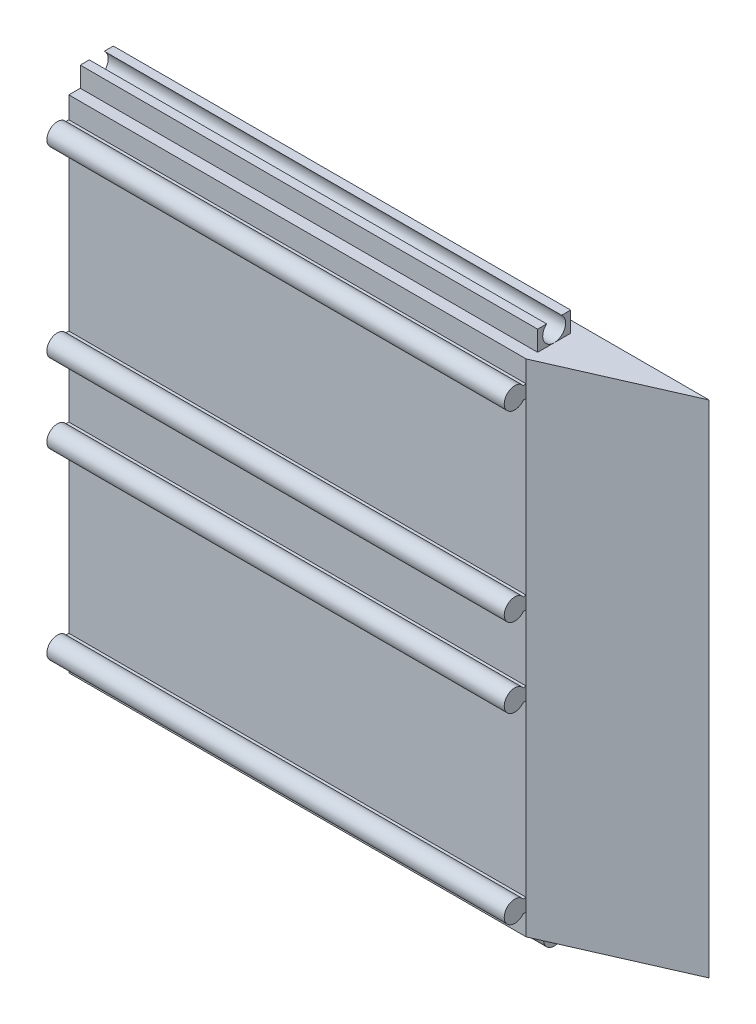
ISO-10303-21;
HEADER;
FILE_DESCRIPTION(('STEP AP214'),'2;1');
FILE_NAME('part.step','',(''),(''),'','','');
FILE_SCHEMA(('AUTOMOTIVE_DESIGN { 1 0 10303 214 1 1 1 1 }'));
ENDSEC;
DATA;
#1=APPLICATION_CONTEXT('core data for automotive mechanical design processes');
#2=APPLICATION_PROTOCOL_DEFINITION('international standard','automotive_design',2000,#1);
#3=PRODUCT_CONTEXT('',#1,'mechanical');
#4=PRODUCT('Part','Part','',(#3));
#5=PRODUCT_RELATED_PRODUCT_CATEGORY('part','',(#4));
#6=PRODUCT_DEFINITION_FORMATION('','',#4);
#7=PRODUCT_DEFINITION_CONTEXT('part definition',#1,'design');
#8=PRODUCT_DEFINITION('design','',#6,#7);
#9=PRODUCT_DEFINITION_SHAPE('','',#8);
#10=(LENGTH_UNIT() NAMED_UNIT(*) SI_UNIT(.MILLI.,.METRE.));
#11=(NAMED_UNIT(*) PLANE_ANGLE_UNIT() SI_UNIT($,.RADIAN.));
#12=(NAMED_UNIT(*) SI_UNIT($,.STERADIAN.) SOLID_ANGLE_UNIT());
#13=UNCERTAINTY_MEASURE_WITH_UNIT(LENGTH_MEASURE(1.E-05),#10,'distance_accuracy_value','');
#14=(GEOMETRIC_REPRESENTATION_CONTEXT(3) GLOBAL_UNCERTAINTY_ASSIGNED_CONTEXT((#13)) GLOBAL_UNIT_ASSIGNED_CONTEXT((#10,
#11,#12)) REPRESENTATION_CONTEXT('',''));
#15=CARTESIAN_POINT('',(0.,0.,0.));
#16=DIRECTION('',(0.,0.,1.));
#17=DIRECTION('',(1.,0.,0.));
#18=AXIS2_PLACEMENT_3D('',#15,#16,#17);
#19=CARTESIAN_POINT('',(0.,45.7500000000069,11.));
#20=DIRECTION('',(0.,0.,1.));
#21=DIRECTION('',(0.,-1.,0.));
#22=AXIS2_PLACEMENT_3D('',#19,#20,#21);
#23=PLANE('',#22);
#24=DIRECTION('',(0.,-1.,0.));
#25=VECTOR('',#24,1.);
#26=CARTESIAN_POINT('',(90.,164.500000000007,11.));
#27=LINE('',#26,#25);
#28=CARTESIAN_POINT('',(90.,140.,11.));
#29=VERTEX_POINT('',#28);
#30=CARTESIAN_POINT('',(90.,135.750000000001,11.));
#31=VERTEX_POINT('',#30);
#32=EDGE_CURVE('E246',#29,#31,#27,.T.);
#33=ORIENTED_EDGE('',*,*,#32,.F.);
#34=DIRECTION('',(-1.,0.,0.));
#35=VECTOR('',#34,1.);
#36=CARTESIAN_POINT('',(90.,140.,11.));
#37=LINE('',#36,#35);
#38=CARTESIAN_POINT('',(0.,140.,11.));
#39=VERTEX_POINT('',#38);
#40=EDGE_CURVE('E456',#29,#39,#37,.T.);
#41=ORIENTED_EDGE('',*,*,#40,.T.);
#42=DIRECTION('',(0.,-1.,0.));
#43=VECTOR('',#42,1.);
#44=CARTESIAN_POINT('',(0.,143.950000000007,11.));
#45=LINE('',#44,#43);
#46=CARTESIAN_POINT('',(0.,135.750000000001,11.));
#47=VERTEX_POINT('',#46);
#48=EDGE_CURVE('E319',#39,#47,#45,.T.);
#49=ORIENTED_EDGE('',*,*,#48,.T.);
#50=DIRECTION('',(1.,0.,0.));
#51=VECTOR('',#50,1.);
#52=CARTESIAN_POINT('',(90.,135.750000000001,11.));
#53=LINE('',#52,#51);
#54=EDGE_CURVE('E436',#47,#31,#53,.T.);
#55=ORIENTED_EDGE('',*,*,#54,.T.);
#56=EDGE_LOOP('',(#33,#41,#49,#55));
#57=FACE_BOUND('',#56,.T.);
#58=ADVANCED_FACE('F33',(#57),#23,.T.);
#59=CARTESIAN_POINT('',(90.,133.25,11.));
#60=VERTEX_POINT('',#59);
#61=CARTESIAN_POINT('',(90.,99.7500000000067,11.));
#62=VERTEX_POINT('',#61);
#63=EDGE_CURVE('E499',#60,#62,#27,.T.);
#64=ORIENTED_EDGE('',*,*,#63,.F.);
#65=DIRECTION('',(1.,0.,0.));
#66=VECTOR('',#65,1.);
#67=CARTESIAN_POINT('',(0.,133.25,11.));
#68=LINE('',#67,#66);
#69=CARTESIAN_POINT('',(0.,133.25,11.));
#70=VERTEX_POINT('',#69);
#71=EDGE_CURVE('E296',#70,#60,#68,.T.);
#72=ORIENTED_EDGE('',*,*,#71,.F.);
#73=DIRECTION('',(0.,-1.,0.));
#74=VECTOR('',#73,1.);
#75=CARTESIAN_POINT('',(0.,133.25,11.));
#76=LINE('',#75,#74);
#77=CARTESIAN_POINT('',(0.,99.7500000000067,11.));
#78=VERTEX_POINT('',#77);
#79=EDGE_CURVE('E425',#70,#78,#76,.T.);
#80=ORIENTED_EDGE('',*,*,#79,.T.);
#81=DIRECTION('',(1.,0.,0.));
#82=VECTOR('',#81,1.);
#83=CARTESIAN_POINT('',(0.,99.7500000000067,11.));
#84=LINE('',#83,#82);
#85=EDGE_CURVE('E293',#78,#62,#84,.T.);
#86=ORIENTED_EDGE('',*,*,#85,.T.);
#87=EDGE_LOOP('',(#64,#72,#80,#86));
#88=FACE_BOUND('',#87,.T.);
#89=ADVANCED_FACE('F555',(#88),#23,.T.);
#90=CARTESIAN_POINT('',(90.,97.2500000000069,11.));
#91=VERTEX_POINT('',#90);
#92=CARTESIAN_POINT('',(90.,84.25,11.));
#93=VERTEX_POINT('',#92);
#94=EDGE_CURVE('E502',#91,#93,#27,.T.);
#95=ORIENTED_EDGE('',*,*,#94,.F.);
#96=DIRECTION('',(1.,0.,0.));
#97=VECTOR('',#96,1.);
#98=CARTESIAN_POINT('',(0.,97.2500000000069,11.));
#99=LINE('',#98,#97);
#100=CARTESIAN_POINT('',(0.,97.2500000000069,11.));
#101=VERTEX_POINT('',#100);
#102=EDGE_CURVE('E286',#101,#91,#99,.T.);
#103=ORIENTED_EDGE('',*,*,#102,.F.);
#104=DIRECTION('',(0.,-1.,0.));
#105=VECTOR('',#104,1.);
#106=CARTESIAN_POINT('',(0.,97.2500000000069,11.));
#107=LINE('',#106,#105);
#108=CARTESIAN_POINT('',(0.,84.25,11.));
#109=VERTEX_POINT('',#108);
#110=EDGE_CURVE('E413',#101,#109,#107,.T.);
#111=ORIENTED_EDGE('',*,*,#110,.T.);
#112=DIRECTION('',(1.,0.,0.));
#113=VECTOR('',#112,1.);
#114=CARTESIAN_POINT('',(0.,84.25,11.));
#115=LINE('',#114,#113);
#116=EDGE_CURVE('E283',#109,#93,#115,.T.);
#117=ORIENTED_EDGE('',*,*,#116,.T.);
#118=EDGE_LOOP('',(#95,#103,#111,#117));
#119=FACE_BOUND('',#118,.T.);
#120=ADVANCED_FACE('F540',(#119),#23,.T.);
#121=CARTESIAN_POINT('',(90.,81.7500000000004,11.));
#122=VERTEX_POINT('',#121);
#123=CARTESIAN_POINT('',(90.,48.2500000000067,11.));
#124=VERTEX_POINT('',#123);
#125=EDGE_CURVE('E244',#122,#124,#27,.T.);
#126=ORIENTED_EDGE('',*,*,#125,.F.);
#127=DIRECTION('',(1.,0.,0.));
#128=VECTOR('',#127,1.);
#129=CARTESIAN_POINT('',(0.,81.7500000000004,11.));
#130=LINE('',#129,#128);
#131=CARTESIAN_POINT('',(0.,81.7500000000004,11.));
#132=VERTEX_POINT('',#131);
#133=EDGE_CURVE('E276',#132,#122,#130,.T.);
#134=ORIENTED_EDGE('',*,*,#133,.F.);
#135=DIRECTION('',(0.,-1.,0.));
#136=VECTOR('',#135,1.);
#137=CARTESIAN_POINT('',(0.,81.7500000000004,11.));
#138=LINE('',#137,#136);
#139=CARTESIAN_POINT('',(0.,48.2500000000067,11.));
#140=VERTEX_POINT('',#139);
#141=EDGE_CURVE('E401',#132,#140,#138,.T.);
#142=ORIENTED_EDGE('',*,*,#141,.T.);
#143=DIRECTION('',(1.,0.,0.));
#144=VECTOR('',#143,1.);
#145=CARTESIAN_POINT('',(0.,48.2500000000067,11.));
#146=LINE('',#145,#144);
#147=EDGE_CURVE('E273',#140,#124,#146,.T.);
#148=ORIENTED_EDGE('',*,*,#147,.T.);
#149=EDGE_LOOP('',(#126,#134,#142,#148));
#150=FACE_BOUND('',#149,.T.);
#151=ADVANCED_FACE('F514',(#150),#23,.T.);
#152=CARTESIAN_POINT('',(90.,39.2500000000069,-5.49999999999999));
#153=DIRECTION('',(1.,0.,0.));
#154=DIRECTION('',(0.,0.,-1.));
#155=AXIS2_PLACEMENT_3D('',#152,#153,#154);
#156=PLANE('',#155);
#157=DIRECTION('',(0.,-1.,0.));
#158=VECTOR('',#157,1.);
#159=CARTESIAN_POINT('',(90.,41.5000000000069,11.));
#160=LINE('',#159,#158);
#161=EDGE_CURVE('E11',#31,#60,#160,.T.);
#162=ORIENTED_EDGE('',*,*,#161,.F.);
#163=DIRECTION('',(0.,0.,1.));
#164=VECTOR('',#163,1.);
#165=CARTESIAN_POINT('',(90.,135.750000000001,-6.74999999999999));
#166=LINE('',#165,#164);
#167=CARTESIAN_POINT('',(90.,135.750000000001,11.5937617924897));
#168=VERTEX_POINT('',#167);
#169=EDGE_CURVE('E316',#31,#168,#166,.T.);
#170=ORIENTED_EDGE('',*,*,#169,.T.);
#171=CARTESIAN_POINT('',(90.,134.500000000007,13.25));
#172=DIRECTION('',(1.,0.,0.));
#173=DIRECTION('',(0.,0.,-1.));
#174=AXIS2_PLACEMENT_3D('',#171,#172,#173);
#175=CIRCLE('',#174,2.075);
#176=CARTESIAN_POINT('',(90.,133.25,11.5937617925001));
#177=VERTEX_POINT('',#176);
#178=EDGE_CURVE('E318',#168,#177,#175,.T.);
#179=ORIENTED_EDGE('',*,*,#178,.T.);
#180=DIRECTION('',(0.,0.,-1.));
#181=VECTOR('',#180,1.);
#182=CARTESIAN_POINT('',(90.,133.25,11.5937617925001));
#183=LINE('',#182,#181);
#184=EDGE_CURVE('E322',#177,#60,#183,.T.);
#185=ORIENTED_EDGE('',*,*,#184,.T.);
#186=EDGE_LOOP('',(#162,#170,#179,#185));
#187=FACE_BOUND('',#186,.T.);
#188=ADVANCED_FACE('F561',(#187),#156,.T.);
#189=EDGE_CURVE('E42',#62,#91,#160,.T.);
#190=ORIENTED_EDGE('',*,*,#189,.F.);
#191=DIRECTION('',(0.,0.,1.));
#192=VECTOR('',#191,1.);
#193=CARTESIAN_POINT('',(90.,99.7500000000067,11.));
#194=LINE('',#193,#192);
#195=CARTESIAN_POINT('',(90.,99.7500000000067,11.5937617924998));
#196=VERTEX_POINT('',#195);
#197=EDGE_CURVE('E325',#62,#196,#194,.T.);
#198=ORIENTED_EDGE('',*,*,#197,.T.);
#199=CARTESIAN_POINT('',(90.,98.5000000000005,13.2499999999997));
#200=DIRECTION('',(1.,0.,0.));
#201=DIRECTION('',(0.,0.,-1.));
#202=AXIS2_PLACEMENT_3D('',#199,#200,#201);
#203=CIRCLE('',#202,2.07499999999946);
#204=CARTESIAN_POINT('',(90.,97.2500000000069,11.5937617924904));
#205=VERTEX_POINT('',#204);
#206=EDGE_CURVE('E328',#196,#205,#203,.T.);
#207=ORIENTED_EDGE('',*,*,#206,.T.);
#208=DIRECTION('',(0.,0.,-1.));
#209=VECTOR('',#208,1.);
#210=CARTESIAN_POINT('',(90.,97.2500000000069,11.5937617924904));
#211=LINE('',#210,#209);
#212=EDGE_CURVE('E331',#205,#91,#211,.T.);
#213=ORIENTED_EDGE('',*,*,#212,.T.);
#214=EDGE_LOOP('',(#190,#198,#207,#213));
#215=FACE_BOUND('',#214,.T.);
#216=ADVANCED_FACE('F624',(#215),#156,.T.);
#217=EDGE_CURVE('E508',#93,#122,#160,.T.);
#218=ORIENTED_EDGE('',*,*,#217,.F.);
#219=DIRECTION('',(0.,7.4792486729047E-13,1.));
#220=VECTOR('',#219,1.);
#221=CARTESIAN_POINT('',(90.,84.25,11.));
#222=LINE('',#221,#220);
#223=CARTESIAN_POINT('',(90.,84.2500000000005,11.5937617924898));
#224=VERTEX_POINT('',#223);
#225=EDGE_CURVE('E334',#93,#224,#222,.T.);
#226=ORIENTED_EDGE('',*,*,#225,.T.);
#227=CARTESIAN_POINT('',(90.,83.0000000000071,13.25));
#228=DIRECTION('',(1.,0.,0.));
#229=DIRECTION('',(0.,0.,-1.));
#230=AXIS2_PLACEMENT_3D('',#227,#228,#229);
#231=CIRCLE('',#230,2.075);
#232=CARTESIAN_POINT('',(90.,81.7500000000004,11.5937617924999));
#233=VERTEX_POINT('',#232);
#234=EDGE_CURVE('E337',#224,#233,#231,.T.);
#235=ORIENTED_EDGE('',*,*,#234,.T.);
#236=DIRECTION('',(0.,0.,-1.));
#237=VECTOR('',#236,1.);
#238=CARTESIAN_POINT('',(90.,81.7500000000004,11.5937617924999));
#239=LINE('',#238,#237);
#240=EDGE_CURVE('E340',#233,#122,#239,.T.);
#241=ORIENTED_EDGE('',*,*,#240,.T.);
#242=EDGE_LOOP('',(#218,#226,#235,#241));
#243=FACE_BOUND('',#242,.T.);
#244=ADVANCED_FACE('F907',(#243),#156,.T.);
#245=CARTESIAN_POINT('',(90.,45.7500000000069,11.));
#246=VERTEX_POINT('',#245);
#247=EDGE_CURVE('E44',#124,#246,#160,.T.);
#248=ORIENTED_EDGE('',*,*,#247,.F.);
#249=DIRECTION('',(0.,0.,1.));
#250=VECTOR('',#249,1.);
#251=CARTESIAN_POINT('',(90.,48.2500000000067,11.));
#252=LINE('',#251,#250);
#253=CARTESIAN_POINT('',(90.,48.2500000000067,11.5937617924998));
#254=VERTEX_POINT('',#253);
#255=EDGE_CURVE('E343',#124,#254,#252,.T.);
#256=ORIENTED_EDGE('',*,*,#255,.T.);
#257=CARTESIAN_POINT('',(90.,47.0000000000005,13.2499999999997));
#258=DIRECTION('',(1.,0.,0.));
#259=DIRECTION('',(0.,0.,-1.));
#260=AXIS2_PLACEMENT_3D('',#257,#258,#259);
#261=CIRCLE('',#260,2.07499999999947);
#262=CARTESIAN_POINT('',(90.,45.7500000000069,11.5937617924904));
#263=VERTEX_POINT('',#262);
#264=EDGE_CURVE('E346',#254,#263,#261,.T.);
#265=ORIENTED_EDGE('',*,*,#264,.T.);
#266=DIRECTION('',(0.,0.,-1.));
#267=VECTOR('',#266,1.);
#268=CARTESIAN_POINT('',(90.,45.7500000000069,11.5937617924904));
#269=LINE('',#268,#267);
#270=EDGE_CURVE('E349',#263,#246,#269,.T.);
#271=ORIENTED_EDGE('',*,*,#270,.T.);
#272=EDGE_LOOP('',(#248,#256,#265,#271));
#273=FACE_BOUND('',#272,.T.);
#274=ADVANCED_FACE('F511',(#273),#156,.T.);
#275=DIRECTION('',(0.,0.,1.));
#276=VECTOR('',#275,1.);
#277=CARTESIAN_POINT('',(90.,140.,11.));
#278=LINE('',#277,#276);
#279=CARTESIAN_POINT('',(90.,140.,2.25));
#280=VERTEX_POINT('',#279);
#281=CARTESIAN_POINT('',(90.,140.,5.5));
#282=VERTEX_POINT('',#281);
#283=EDGE_CURVE('E490',#280,#282,#278,.T.);
#284=ORIENTED_EDGE('',*,*,#283,.F.);
#285=DIRECTION('',(0.,1.,0.));
#286=VECTOR('',#285,1.);
#287=CARTESIAN_POINT('',(90.,140.,2.25));
#288=LINE('',#287,#286);
#289=CARTESIAN_POINT('',(90.,143.95,2.25));
#290=VERTEX_POINT('',#289);
#291=EDGE_CURVE('E449',#280,#290,#288,.T.);
#292=ORIENTED_EDGE('',*,*,#291,.T.);
#293=DIRECTION('',(0.,0.,-1.));
#294=VECTOR('',#293,1.);
#295=CARTESIAN_POINT('',(90.,143.950000000007,-6.74999999999999));
#296=LINE('',#295,#294);
#297=CARTESIAN_POINT('',(90.,143.950000000007,4.02605970271009));
#298=VERTEX_POINT('',#297);
#299=EDGE_CURVE('E443',#298,#290,#296,.T.);
#300=ORIENTED_EDGE('',*,*,#299,.F.);
#301=CARTESIAN_POINT('',(90.,142.25,5.5));
#302=DIRECTION('',(-1.,0.,0.));
#303=DIRECTION('',(0.,0.,1.));
#304=AXIS2_PLACEMENT_3D('',#301,#302,#303);
#305=CIRCLE('',#304,2.25);
#306=EDGE_CURVE('E477',#298,#282,#305,.T.);
#307=ORIENTED_EDGE('',*,*,#306,.T.);
#308=EDGE_LOOP('',(#284,#292,#300,#307));
#309=FACE_BOUND('',#308,.T.);
#310=ADVANCED_FACE('F591',(#309),#156,.T.);
#311=CARTESIAN_POINT('',(90.,140.,8.75));
#312=VERTEX_POINT('',#311);
#313=EDGE_CURVE('E51',#282,#312,#278,.T.);
#314=ORIENTED_EDGE('',*,*,#313,.F.);
#315=CARTESIAN_POINT('',(90.,143.950000000007,6.97394029728991));
#316=VERTEX_POINT('',#315);
#317=EDGE_CURVE('E480',#282,#316,#305,.T.);
#318=ORIENTED_EDGE('',*,*,#317,.T.);
#319=CARTESIAN_POINT('',(90.,143.95,8.74999999999999));
#320=VERTEX_POINT('',#319);
#321=EDGE_CURVE('E435',#320,#316,#296,.T.);
#322=ORIENTED_EDGE('',*,*,#321,.F.);
#323=DIRECTION('',(0.,-1.,0.));
#324=VECTOR('',#323,1.);
#325=CARTESIAN_POINT('',(90.,143.95,8.74999999999999));
#326=LINE('',#325,#324);
#327=EDGE_CURVE('E463',#320,#312,#326,.T.);
#328=ORIENTED_EDGE('',*,*,#327,.T.);
#329=EDGE_LOOP('',(#314,#318,#322,#328));
#330=FACE_BOUND('',#329,.T.);
#331=ADVANCED_FACE('F577',(#330),#156,.T.);
#332=CARTESIAN_POINT('',(0.,39.2500000000069,-5.49999999999999));
#333=DIRECTION('',(1.,0.,0.));
#334=DIRECTION('',(0.,0.,-1.));
#335=AXIS2_PLACEMENT_3D('',#332,#333,#334);
#336=PLANE('',#335);
#337=DIRECTION('',(0.,0.,1.));
#338=VECTOR('',#337,1.);
#339=CARTESIAN_POINT('',(0.,140.,-2.25000000000001));
#340=LINE('',#339,#338);
#341=CARTESIAN_POINT('',(0.,140.,1.23116049695791E-13));
#342=VERTEX_POINT('',#341);
#343=CARTESIAN_POINT('',(0.,140.,2.25));
#344=VERTEX_POINT('',#343);
#345=EDGE_CURVE('E454',#342,#344,#340,.T.);
#346=ORIENTED_EDGE('',*,*,#345,.F.);
#347=DIRECTION('',(0.,-1.,0.));
#348=VECTOR('',#347,1.);
#349=CARTESIAN_POINT('',(0.,39.2500000000069,0.));
#350=LINE('',#349,#348);
#351=CARTESIAN_POINT('',(0.,41.5000000000069,0.));
#352=VERTEX_POINT('',#351);
#353=EDGE_CURVE('E485',#342,#352,#350,.T.);
#354=ORIENTED_EDGE('',*,*,#353,.T.);
#355=DIRECTION('',(0.,0.,-1.));
#356=VECTOR('',#355,1.);
#357=CARTESIAN_POINT('',(0.,41.5000000000069,4.25));
#358=LINE('',#357,#356);
#359=CARTESIAN_POINT('',(0.,41.5000000000069,4.25));
#360=VERTEX_POINT('',#359);
#361=EDGE_CURVE('E304',#360,#352,#358,.T.);
#362=ORIENTED_EDGE('',*,*,#361,.F.);
#363=DIRECTION('',(0.,1.,0.));
#364=VECTOR('',#363,1.);
#365=CARTESIAN_POINT('',(0.,40.906238207512,4.25));
#366=LINE('',#365,#364);
#367=CARTESIAN_POINT('',(0.,40.906238207512,4.25));
#368=VERTEX_POINT('',#367);
#369=EDGE_CURVE('E308',#368,#360,#366,.T.);
#370=ORIENTED_EDGE('',*,*,#369,.F.);
#371=CARTESIAN_POINT('',(0.,39.2500000000069,5.5));
#372=DIRECTION('',(1.,0.,0.));
#373=DIRECTION('',(0.,0.,-1.));
#374=AXIS2_PLACEMENT_3D('',#371,#372,#373);
#375=CIRCLE('',#374,2.075);
#376=CARTESIAN_POINT('',(0.,40.906238207512,6.75));
#377=VERTEX_POINT('',#376);
#378=EDGE_CURVE('E312',#377,#368,#375,.T.);
#379=ORIENTED_EDGE('',*,*,#378,.F.);
#380=DIRECTION('',(0.,-1.,0.));
#381=VECTOR('',#380,1.);
#382=CARTESIAN_POINT('',(0.,41.5000000000069,6.75));
#383=LINE('',#382,#381);
#384=CARTESIAN_POINT('',(0.,41.5000000000069,6.75));
#385=VERTEX_POINT('',#384);
#386=EDGE_CURVE('E372',#385,#377,#383,.T.);
#387=ORIENTED_EDGE('',*,*,#386,.F.);
#388=DIRECTION('',(0.,0.,-1.));
#389=VECTOR('',#388,1.);
#390=CARTESIAN_POINT('',(0.,41.5000000000069,11.));
#391=LINE('',#390,#389);
#392=CARTESIAN_POINT('',(0.,41.5000000000069,11.));
#393=VERTEX_POINT('',#392);
#394=EDGE_CURVE('E383',#393,#385,#391,.T.);
#395=ORIENTED_EDGE('',*,*,#394,.F.);
#396=DIRECTION('',(0.,-1.,0.));
#397=VECTOR('',#396,1.);
#398=CARTESIAN_POINT('',(0.,45.7500000000069,11.));
#399=LINE('',#398,#397);
#400=CARTESIAN_POINT('',(0.,45.7500000000069,11.));
#401=VERTEX_POINT('',#400);
#402=EDGE_CURVE('E259',#401,#393,#399,.T.);
#403=ORIENTED_EDGE('',*,*,#402,.F.);
#404=DIRECTION('',(0.,0.,-1.));
#405=VECTOR('',#404,1.);
#406=CARTESIAN_POINT('',(0.,45.7500000000069,11.5937617924904));
#407=LINE('',#406,#405);
#408=CARTESIAN_POINT('',(0.,45.7500000000069,11.5937617924904));
#409=VERTEX_POINT('',#408);
#410=EDGE_CURVE('E392',#409,#401,#407,.T.);
#411=ORIENTED_EDGE('',*,*,#410,.F.);
#412=CARTESIAN_POINT('',(0.,47.0000000000005,13.2499999999997));
#413=DIRECTION('',(1.,0.,0.));
#414=DIRECTION('',(0.,0.,-1.));
#415=AXIS2_PLACEMENT_3D('',#412,#413,#414);
#416=CIRCLE('',#415,2.07499999999947);
#417=CARTESIAN_POINT('',(0.,48.2500000000067,11.5937617924998));
#418=VERTEX_POINT('',#417);
#419=EDGE_CURVE('E395',#418,#409,#416,.T.);
#420=ORIENTED_EDGE('',*,*,#419,.F.);
#421=DIRECTION('',(0.,0.,1.));
#422=VECTOR('',#421,1.);
#423=CARTESIAN_POINT('',(0.,48.2500000000067,11.));
#424=LINE('',#423,#422);
#425=EDGE_CURVE('E398',#140,#418,#424,.T.);
#426=ORIENTED_EDGE('',*,*,#425,.F.);
#427=ORIENTED_EDGE('',*,*,#141,.F.);
#428=DIRECTION('',(0.,0.,-1.));
#429=VECTOR('',#428,1.);
#430=CARTESIAN_POINT('',(0.,81.7500000000004,11.5937617924999));
#431=LINE('',#430,#429);
#432=CARTESIAN_POINT('',(0.,81.7500000000004,11.5937617924999));
#433=VERTEX_POINT('',#432);
#434=EDGE_CURVE('E404',#433,#132,#431,.T.);
#435=ORIENTED_EDGE('',*,*,#434,.F.);
#436=CARTESIAN_POINT('',(0.,83.0000000000071,13.25));
#437=DIRECTION('',(1.,0.,0.));
#438=DIRECTION('',(0.,0.,-1.));
#439=AXIS2_PLACEMENT_3D('',#436,#437,#438);
#440=CIRCLE('',#439,2.075);
#441=CARTESIAN_POINT('',(0.,84.2500000000005,11.5937617924898));
#442=VERTEX_POINT('',#441);
#443=EDGE_CURVE('E407',#442,#433,#440,.T.);
#444=ORIENTED_EDGE('',*,*,#443,.F.);
#445=DIRECTION('',(0.,7.4792486729047E-13,1.));
#446=VECTOR('',#445,1.);
#447=CARTESIAN_POINT('',(0.,84.25,11.));
#448=LINE('',#447,#446);
#449=EDGE_CURVE('E410',#109,#442,#448,.T.);
#450=ORIENTED_EDGE('',*,*,#449,.F.);
#451=ORIENTED_EDGE('',*,*,#110,.F.);
#452=DIRECTION('',(0.,0.,-1.));
#453=VECTOR('',#452,1.);
#454=CARTESIAN_POINT('',(0.,97.2500000000069,11.5937617924904));
#455=LINE('',#454,#453);
#456=CARTESIAN_POINT('',(0.,97.2500000000069,11.5937617924904));
#457=VERTEX_POINT('',#456);
#458=EDGE_CURVE('E416',#457,#101,#455,.T.);
#459=ORIENTED_EDGE('',*,*,#458,.F.);
#460=CARTESIAN_POINT('',(0.,98.5000000000005,13.2499999999997));
#461=DIRECTION('',(1.,0.,0.));
#462=DIRECTION('',(0.,0.,-1.));
#463=AXIS2_PLACEMENT_3D('',#460,#461,#462);
#464=CIRCLE('',#463,2.07499999999946);
#465=CARTESIAN_POINT('',(0.,99.7500000000067,11.5937617924998));
#466=VERTEX_POINT('',#465);
#467=EDGE_CURVE('E419',#466,#457,#464,.T.);
#468=ORIENTED_EDGE('',*,*,#467,.F.);
#469=DIRECTION('',(0.,0.,1.));
#470=VECTOR('',#469,1.);
#471=CARTESIAN_POINT('',(0.,99.7500000000067,11.));
#472=LINE('',#471,#470);
#473=EDGE_CURVE('E422',#78,#466,#472,.T.);
#474=ORIENTED_EDGE('',*,*,#473,.F.);
#475=ORIENTED_EDGE('',*,*,#79,.F.);
#476=DIRECTION('',(0.,0.,-1.));
#477=VECTOR('',#476,1.);
#478=CARTESIAN_POINT('',(0.,133.25,11.5937617925001));
#479=LINE('',#478,#477);
#480=CARTESIAN_POINT('',(0.,133.25,11.5937617925001));
#481=VERTEX_POINT('',#480);
#482=EDGE_CURVE('E428',#481,#70,#479,.T.);
#483=ORIENTED_EDGE('',*,*,#482,.F.);
#484=CARTESIAN_POINT('',(0.,134.500000000007,13.25));
#485=DIRECTION('',(1.,0.,0.));
#486=DIRECTION('',(0.,0.,-1.));
#487=AXIS2_PLACEMENT_3D('',#484,#485,#486);
#488=CIRCLE('',#487,2.075);
#489=CARTESIAN_POINT('',(0.,135.750000000001,11.5937617924897));
#490=VERTEX_POINT('',#489);
#491=EDGE_CURVE('E431',#490,#481,#488,.T.);
#492=ORIENTED_EDGE('',*,*,#491,.F.);
#493=DIRECTION('',(0.,0.,1.));
#494=VECTOR('',#493,1.);
#495=CARTESIAN_POINT('',(0.,135.750000000001,-6.74999999999999));
#496=LINE('',#495,#494);
#497=EDGE_CURVE('E361',#47,#490,#496,.T.);
#498=ORIENTED_EDGE('',*,*,#497,.F.);
#499=ORIENTED_EDGE('',*,*,#48,.F.);
#500=DIRECTION('',(0.,0.,1.));
#501=VECTOR('',#500,1.);
#502=CARTESIAN_POINT('',(0.,140.,8.75));
#503=LINE('',#502,#501);
#504=CARTESIAN_POINT('',(0.,140.,8.75));
#505=VERTEX_POINT('',#504);
#506=EDGE_CURVE('E466',#505,#39,#503,.T.);
#507=ORIENTED_EDGE('',*,*,#506,.F.);
#508=DIRECTION('',(0.,-1.,0.));
#509=VECTOR('',#508,1.);
#510=CARTESIAN_POINT('',(0.,143.95,8.74999999999999));
#511=LINE('',#510,#509);
#512=CARTESIAN_POINT('',(0.,143.95,8.74999999999999));
#513=VERTEX_POINT('',#512);
#514=EDGE_CURVE('E469',#513,#505,#511,.T.);
#515=ORIENTED_EDGE('',*,*,#514,.F.);
#516=DIRECTION('',(0.,0.,1.));
#517=VECTOR('',#516,1.);
#518=CARTESIAN_POINT('',(0.,143.950000000007,11.));
#519=LINE('',#518,#517);
#520=CARTESIAN_POINT('',(0.,143.950000000007,6.97394029728991));
#521=VERTEX_POINT('',#520);
#522=EDGE_CURVE('E439',#521,#513,#519,.T.);
#523=ORIENTED_EDGE('',*,*,#522,.F.);
#524=CARTESIAN_POINT('',(0.,142.25,5.5));
#525=DIRECTION('',(-1.,0.,0.));
#526=DIRECTION('',(0.,0.,1.));
#527=AXIS2_PLACEMENT_3D('',#524,#525,#526);
#528=CIRCLE('',#527,2.25);
#529=CARTESIAN_POINT('',(0.,143.950000000007,4.02605970271009));
#530=VERTEX_POINT('',#529);
#531=EDGE_CURVE('E364',#530,#521,#528,.T.);
#532=ORIENTED_EDGE('',*,*,#531,.F.);
#533=CARTESIAN_POINT('',(0.,143.95,2.25));
#534=VERTEX_POINT('',#533);
#535=EDGE_CURVE('E445',#534,#530,#519,.T.);
#536=ORIENTED_EDGE('',*,*,#535,.F.);
#537=DIRECTION('',(0.,1.,0.));
#538=VECTOR('',#537,1.);
#539=CARTESIAN_POINT('',(0.,140.,2.25));
#540=LINE('',#539,#538);
#541=EDGE_CURVE('E452',#344,#534,#540,.T.);
#542=ORIENTED_EDGE('',*,*,#541,.F.);
#543=EDGE_LOOP('',(#346,#354,#362,#370,#379,#387,#395,#403,#411,#420,#426,#427,#435,#444,#450,
#451,#459,#468,#474,#475,#483,#492,#498,#499,#507,#515,#523,#532,#536,#542));
#544=FACE_BOUND('',#543,.T.);
#545=ADVANCED_FACE('F386',(#544),#336,.F.);
#546=CARTESIAN_POINT('',(0.,143.950000000007,0.));
#547=DIRECTION('',(0.,-1.,0.));
#548=DIRECTION('',(0.,0.,-1.));
#549=AXIS2_PLACEMENT_3D('',#546,#547,#548);
#550=PLANE('',#549);
#551=ORIENTED_EDGE('',*,*,#321,.T.);
#552=DIRECTION('',(-1.,0.,0.));
#553=VECTOR('',#552,1.);
#554=CARTESIAN_POINT('',(0.,143.950000000007,6.97394029728991));
#555=LINE('',#554,#553);
#556=EDGE_CURVE('E472',#316,#521,#555,.T.);
#557=ORIENTED_EDGE('',*,*,#556,.T.);
#558=ORIENTED_EDGE('',*,*,#522,.T.);
#559=DIRECTION('',(-1.,0.,0.));
#560=VECTOR('',#559,1.);
#561=CARTESIAN_POINT('',(90.,143.95,8.74999999999999));
#562=LINE('',#561,#560);
#563=EDGE_CURVE('E459',#320,#513,#562,.T.);
#564=ORIENTED_EDGE('',*,*,#563,.F.);
#565=EDGE_LOOP('',(#551,#557,#558,#564));
#566=FACE_BOUND('',#565,.T.);
#567=ADVANCED_FACE('F576',(#566),#550,.F.);
#568=ORIENTED_EDGE('',*,*,#535,.T.);
#569=DIRECTION('',(-1.,0.,0.));
#570=VECTOR('',#569,1.);
#571=CARTESIAN_POINT('',(0.,143.950000000007,4.02605970271009));
#572=LINE('',#571,#570);
#573=EDGE_CURVE('E59',#530,#298,#572,.F.);
#574=ORIENTED_EDGE('',*,*,#573,.T.);
#575=ORIENTED_EDGE('',*,*,#299,.T.);
#576=DIRECTION('',(-1.,0.,0.));
#577=VECTOR('',#576,1.);
#578=CARTESIAN_POINT('',(90.,143.95,2.25));
#579=LINE('',#578,#577);
#580=EDGE_CURVE('E440',#290,#534,#579,.T.);
#581=ORIENTED_EDGE('',*,*,#580,.T.);
#582=EDGE_LOOP('',(#568,#574,#575,#581));
#583=FACE_BOUND('',#582,.T.);
#584=ADVANCED_FACE('F584',(#583),#550,.F.);
#585=CARTESIAN_POINT('',(0.,135.750000000001,-6.74999999999999));
#586=DIRECTION('',(0.,1.,0.));
#587=DIRECTION('',(0.,0.,1.));
#588=AXIS2_PLACEMENT_3D('',#585,#586,#587);
#589=PLANE('',#588);
#590=ORIENTED_EDGE('',*,*,#169,.F.);
#591=ORIENTED_EDGE('',*,*,#54,.F.);
#592=ORIENTED_EDGE('',*,*,#497,.T.);
#593=DIRECTION('',(1.,0.,0.));
#594=VECTOR('',#593,1.);
#595=CARTESIAN_POINT('',(0.,135.750000000001,11.5937617924897));
#596=LINE('',#595,#594);
#597=EDGE_CURVE('E37',#490,#168,#596,.T.);
#598=ORIENTED_EDGE('',*,*,#597,.T.);
#599=EDGE_LOOP('',(#590,#591,#592,#598));
#600=FACE_BOUND('',#599,.T.);
#601=ADVANCED_FACE('F35',(#600),#589,.T.);
#602=CARTESIAN_POINT('',(0.,41.5000000000069,4.25));
#603=DIRECTION('',(0.,-1.,0.));
#604=DIRECTION('',(0.,0.,-1.));
#605=AXIS2_PLACEMENT_3D('',#602,#603,#604);
#606=PLANE('',#605);
#607=DIRECTION('',(0.915315032422766,0.,-0.402738614266016));
#608=VECTOR('',#607,1.);
#609=CARTESIAN_POINT('',(90.,41.5000000000069,11.));
#610=LINE('',#609,#608);
#611=CARTESIAN_POINT('',(90.,41.5000000000069,11.));
#612=VERTEX_POINT('',#611);
#613=CARTESIAN_POINT('',(115.,41.5000000000069,0.));
#614=VERTEX_POINT('',#613);
#615=EDGE_CURVE('E238',#612,#614,#610,.T.);
#616=ORIENTED_EDGE('',*,*,#615,.F.);
#617=DIRECTION('',(1.,0.,0.));
#618=VECTOR('',#617,1.);
#619=CARTESIAN_POINT('',(0.,41.5000000000069,11.));
#620=LINE('',#619,#618);
#621=EDGE_CURVE('E250',#393,#612,#620,.T.);
#622=ORIENTED_EDGE('',*,*,#621,.F.);
#623=ORIENTED_EDGE('',*,*,#394,.T.);
#624=DIRECTION('',(1.,0.,0.));
#625=VECTOR('',#624,1.);
#626=CARTESIAN_POINT('',(0.,41.5000000000069,6.75));
#627=LINE('',#626,#625);
#628=CARTESIAN_POINT('',(90.,41.5000000000069,6.75));
#629=VERTEX_POINT('',#628);
#630=EDGE_CURVE('E260',#385,#629,#627,.T.);
#631=ORIENTED_EDGE('',*,*,#630,.T.);
#632=DIRECTION('',(0.,0.,-1.));
#633=VECTOR('',#632,1.);
#634=CARTESIAN_POINT('',(90.,41.5000000000069,0.));
#635=LINE('',#634,#633);
#636=CARTESIAN_POINT('',(90.,41.5000000000069,4.25));
#637=VERTEX_POINT('',#636);
#638=EDGE_CURVE('E381',#629,#637,#635,.T.);
#639=ORIENTED_EDGE('',*,*,#638,.T.);
#640=DIRECTION('',(1.,0.,0.));
#641=VECTOR('',#640,1.);
#642=CARTESIAN_POINT('',(0.,41.5000000000069,4.25));
#643=LINE('',#642,#641);
#644=EDGE_CURVE('E362',#360,#637,#643,.T.);
#645=ORIENTED_EDGE('',*,*,#644,.F.);
#646=ORIENTED_EDGE('',*,*,#361,.T.);
#647=DIRECTION('',(-1.,0.,0.));
#648=VECTOR('',#647,1.);
#649=CARTESIAN_POINT('',(0.,41.5000000000069,0.));
#650=LINE('',#649,#648);
#651=EDGE_CURVE('E253',#614,#352,#650,.T.);
#652=ORIENTED_EDGE('',*,*,#651,.F.);
#653=EDGE_LOOP('',(#616,#622,#623,#631,#639,#645,#646,#652));
#654=FACE_BOUND('',#653,.T.);
#655=ADVANCED_FACE('F248',(#654),#606,.T.);
#656=CARTESIAN_POINT('',(0.,40.906238207512,4.25));
#657=DIRECTION('',(0.,0.,-1.));
#658=DIRECTION('',(-1.,0.,0.));
#659=AXIS2_PLACEMENT_3D('',#656,#657,#658);
#660=PLANE('',#659);
#661=DIRECTION('',(0.,1.,0.));
#662=VECTOR('',#661,1.);
#663=CARTESIAN_POINT('',(90.,40.906238207512,4.25));
#664=LINE('',#663,#662);
#665=CARTESIAN_POINT('',(90.,40.906238207512,4.25));
#666=VERTEX_POINT('',#665);
#667=EDGE_CURVE('E358',#666,#637,#664,.T.);
#668=ORIENTED_EDGE('',*,*,#667,.F.);
#669=DIRECTION('',(1.,0.,0.));
#670=VECTOR('',#669,1.);
#671=CARTESIAN_POINT('',(0.,40.906238207512,4.25));
#672=LINE('',#671,#670);
#673=EDGE_CURVE('E365',#368,#666,#672,.T.);
#674=ORIENTED_EDGE('',*,*,#673,.F.);
#675=ORIENTED_EDGE('',*,*,#369,.T.);
#676=ORIENTED_EDGE('',*,*,#644,.T.);
#677=EDGE_LOOP('',(#668,#674,#675,#676));
#678=FACE_BOUND('',#677,.T.);
#679=ADVANCED_FACE('F676',(#678),#660,.T.);
#680=CARTESIAN_POINT('',(0.,39.2500000000069,5.5));
#681=DIRECTION('',(1.,0.,0.));
#682=DIRECTION('',(0.,0.,-1.));
#683=AXIS2_PLACEMENT_3D('',#680,#681,#682);
#684=CYLINDRICAL_SURFACE('',#683,2.075);
#685=CARTESIAN_POINT('',(90.,39.2500000000069,5.5));
#686=DIRECTION('',(1.,0.,0.));
#687=DIRECTION('',(0.,0.,-1.));
#688=AXIS2_PLACEMENT_3D('',#685,#686,#687);
#689=CIRCLE('',#688,2.075);
#690=CARTESIAN_POINT('',(90.,40.906238207512,6.75));
#691=VERTEX_POINT('',#690);
#692=EDGE_CURVE('E355',#691,#666,#689,.T.);
#693=ORIENTED_EDGE('',*,*,#692,.F.);
#694=DIRECTION('',(1.,0.,0.));
#695=VECTOR('',#694,1.);
#696=CARTESIAN_POINT('',(0.,40.906238207512,6.75));
#697=LINE('',#696,#695);
#698=EDGE_CURVE('E264',#377,#691,#697,.T.);
#699=ORIENTED_EDGE('',*,*,#698,.F.);
#700=ORIENTED_EDGE('',*,*,#378,.T.);
#701=ORIENTED_EDGE('',*,*,#673,.T.);
#702=EDGE_LOOP('',(#693,#699,#700,#701));
#703=FACE_BOUND('',#702,.T.);
#704=ADVANCED_FACE('F376',(#703),#684,.T.);
#705=CARTESIAN_POINT('',(0.,41.5000000000069,6.75));
#706=DIRECTION('',(0.,0.,1.));
#707=DIRECTION('',(1.,0.,0.));
#708=AXIS2_PLACEMENT_3D('',#705,#706,#707);
#709=PLANE('',#708);
#710=DIRECTION('',(0.,-1.,0.));
#711=VECTOR('',#710,1.);
#712=CARTESIAN_POINT('',(90.,41.5000000000069,6.75));
#713=LINE('',#712,#711);
#714=EDGE_CURVE('E352',#629,#691,#713,.T.);
#715=ORIENTED_EDGE('',*,*,#714,.F.);
#716=ORIENTED_EDGE('',*,*,#630,.F.);
#717=ORIENTED_EDGE('',*,*,#386,.T.);
#718=ORIENTED_EDGE('',*,*,#698,.T.);
#719=EDGE_LOOP('',(#715,#716,#717,#718));
#720=FACE_BOUND('',#719,.T.);
#721=ADVANCED_FACE('F370',(#720),#709,.T.);
#722=EDGE_CURVE('E235',#246,#612,#27,.T.);
#723=ORIENTED_EDGE('',*,*,#722,.F.);
#724=DIRECTION('',(1.,0.,0.));
#725=VECTOR('',#724,1.);
#726=CARTESIAN_POINT('',(0.,45.7500000000069,11.));
#727=LINE('',#726,#725);
#728=EDGE_CURVE('E261',#401,#246,#727,.T.);
#729=ORIENTED_EDGE('',*,*,#728,.F.);
#730=ORIENTED_EDGE('',*,*,#402,.T.);
#731=ORIENTED_EDGE('',*,*,#621,.T.);
#732=EDGE_LOOP('',(#723,#729,#730,#731));
#733=FACE_BOUND('',#732,.T.);
#734=ADVANCED_FACE('F257',(#733),#23,.T.);
#735=CARTESIAN_POINT('',(0.,45.7500000000069,11.5937617924904));
#736=DIRECTION('',(0.,-1.,0.));
#737=DIRECTION('',(0.,0.,-1.));
#738=AXIS2_PLACEMENT_3D('',#735,#736,#737);
#739=PLANE('',#738);
#740=ORIENTED_EDGE('',*,*,#270,.F.);
#741=DIRECTION('',(1.,0.,0.));
#742=VECTOR('',#741,1.);
#743=CARTESIAN_POINT('',(0.,45.7500000000069,11.5937617924904));
#744=LINE('',#743,#742);
#745=EDGE_CURVE('E266',#409,#263,#744,.T.);
#746=ORIENTED_EDGE('',*,*,#745,.F.);
#747=ORIENTED_EDGE('',*,*,#410,.T.);
#748=ORIENTED_EDGE('',*,*,#728,.T.);
#749=EDGE_LOOP('',(#740,#746,#747,#748));
#750=FACE_BOUND('',#749,.T.);
#751=ADVANCED_FACE('F525',(#750),#739,.T.);
#752=CARTESIAN_POINT('',(0.,47.0000000000005,13.2499999999997));
#753=DIRECTION('',(1.,0.,0.));
#754=DIRECTION('',(0.,0.,-1.));
#755=AXIS2_PLACEMENT_3D('',#752,#753,#754);
#756=CYLINDRICAL_SURFACE('',#755,2.07499999999947);
#757=ORIENTED_EDGE('',*,*,#264,.F.);
#758=DIRECTION('',(1.,0.,0.));
#759=VECTOR('',#758,1.);
#760=CARTESIAN_POINT('',(0.,48.2500000000067,11.5937617924998));
#761=LINE('',#760,#759);
#762=EDGE_CURVE('E271',#418,#254,#761,.T.);
#763=ORIENTED_EDGE('',*,*,#762,.F.);
#764=ORIENTED_EDGE('',*,*,#419,.T.);
#765=ORIENTED_EDGE('',*,*,#745,.T.);
#766=EDGE_LOOP('',(#757,#763,#764,#765));
#767=FACE_BOUND('',#766,.T.);
#768=ADVANCED_FACE('F522',(#767),#756,.T.);
#769=CARTESIAN_POINT('',(0.,48.2500000000067,11.));
#770=DIRECTION('',(0.,1.,0.));
#771=DIRECTION('',(0.,0.,1.));
#772=AXIS2_PLACEMENT_3D('',#769,#770,#771);
#773=PLANE('',#772);
#774=ORIENTED_EDGE('',*,*,#255,.F.);
#775=ORIENTED_EDGE('',*,*,#147,.F.);
#776=ORIENTED_EDGE('',*,*,#425,.T.);
#777=ORIENTED_EDGE('',*,*,#762,.T.);
#778=EDGE_LOOP('',(#774,#775,#776,#777));
#779=FACE_BOUND('',#778,.T.);
#780=ADVANCED_FACE('F518',(#779),#773,.T.);
#781=CARTESIAN_POINT('',(0.,81.7500000000004,11.5937617924999));
#782=DIRECTION('',(0.,-1.,0.));
#783=DIRECTION('',(0.,0.,-1.));
#784=AXIS2_PLACEMENT_3D('',#781,#782,#783);
#785=PLANE('',#784);
#786=ORIENTED_EDGE('',*,*,#240,.F.);
#787=DIRECTION('',(1.,0.,0.));
#788=VECTOR('',#787,1.);
#789=CARTESIAN_POINT('',(0.,81.7500000000004,11.5937617924999));
#790=LINE('',#789,#788);
#791=EDGE_CURVE('E279',#433,#233,#790,.T.);
#792=ORIENTED_EDGE('',*,*,#791,.F.);
#793=ORIENTED_EDGE('',*,*,#434,.T.);
#794=ORIENTED_EDGE('',*,*,#133,.T.);
#795=EDGE_LOOP('',(#786,#792,#793,#794));
#796=FACE_BOUND('',#795,.T.);
#797=ADVANCED_FACE('F530',(#796),#785,.T.);
#798=CARTESIAN_POINT('',(0.,83.0000000000071,13.25));
#799=DIRECTION('',(1.,0.,0.));
#800=DIRECTION('',(0.,0.,-1.));
#801=AXIS2_PLACEMENT_3D('',#798,#799,#800);
#802=CYLINDRICAL_SURFACE('',#801,2.075);
#803=ORIENTED_EDGE('',*,*,#234,.F.);
#804=DIRECTION('',(1.,0.,0.));
#805=VECTOR('',#804,1.);
#806=CARTESIAN_POINT('',(0.,84.2500000000005,11.5937617924898));
#807=LINE('',#806,#805);
#808=EDGE_CURVE('E281',#442,#224,#807,.T.);
#809=ORIENTED_EDGE('',*,*,#808,.F.);
#810=ORIENTED_EDGE('',*,*,#443,.T.);
#811=ORIENTED_EDGE('',*,*,#791,.T.);
#812=EDGE_LOOP('',(#803,#809,#810,#811));
#813=FACE_BOUND('',#812,.T.);
#814=ADVANCED_FACE('F533',(#813),#802,.T.);
#815=CARTESIAN_POINT('',(0.,84.25,11.));
#816=DIRECTION('',(0.,1.,-7.4792486729047E-13));
#817=DIRECTION('',(0.,7.4792486729047E-13,1.));
#818=AXIS2_PLACEMENT_3D('',#815,#816,#817);
#819=PLANE('',#818);
#820=ORIENTED_EDGE('',*,*,#225,.F.);
#821=ORIENTED_EDGE('',*,*,#116,.F.);
#822=ORIENTED_EDGE('',*,*,#449,.T.);
#823=ORIENTED_EDGE('',*,*,#808,.T.);
#824=EDGE_LOOP('',(#820,#821,#822,#823));
#825=FACE_BOUND('',#824,.T.);
#826=ADVANCED_FACE('F538',(#825),#819,.T.);
#827=CARTESIAN_POINT('',(0.,97.2500000000069,11.5937617924904));
#828=DIRECTION('',(0.,-1.,0.));
#829=DIRECTION('',(0.,0.,-1.));
#830=AXIS2_PLACEMENT_3D('',#827,#828,#829);
#831=PLANE('',#830);
#832=ORIENTED_EDGE('',*,*,#212,.F.);
#833=DIRECTION('',(1.,0.,0.));
#834=VECTOR('',#833,1.);
#835=CARTESIAN_POINT('',(0.,97.2500000000069,11.5937617924904));
#836=LINE('',#835,#834);
#837=EDGE_CURVE('E289',#457,#205,#836,.T.);
#838=ORIENTED_EDGE('',*,*,#837,.F.);
#839=ORIENTED_EDGE('',*,*,#458,.T.);
#840=ORIENTED_EDGE('',*,*,#102,.T.);
#841=EDGE_LOOP('',(#832,#838,#839,#840));
#842=FACE_BOUND('',#841,.T.);
#843=ADVANCED_FACE('F545',(#842),#831,.T.);
#844=CARTESIAN_POINT('',(0.,98.5000000000005,13.2499999999997));
#845=DIRECTION('',(1.,0.,0.));
#846=DIRECTION('',(0.,0.,-1.));
#847=AXIS2_PLACEMENT_3D('',#844,#845,#846);
#848=CYLINDRICAL_SURFACE('',#847,2.07499999999946);
#849=ORIENTED_EDGE('',*,*,#206,.F.);
#850=DIRECTION('',(1.,0.,0.));
#851=VECTOR('',#850,1.);
#852=CARTESIAN_POINT('',(0.,99.7500000000067,11.5937617924998));
#853=LINE('',#852,#851);
#854=EDGE_CURVE('E291',#466,#196,#853,.T.);
#855=ORIENTED_EDGE('',*,*,#854,.F.);
#856=ORIENTED_EDGE('',*,*,#467,.T.);
#857=ORIENTED_EDGE('',*,*,#837,.T.);
#858=EDGE_LOOP('',(#849,#855,#856,#857));
#859=FACE_BOUND('',#858,.T.);
#860=ADVANCED_FACE('F548',(#859),#848,.T.);
#861=CARTESIAN_POINT('',(0.,99.7500000000067,11.));
#862=DIRECTION('',(0.,1.,0.));
#863=DIRECTION('',(0.,0.,1.));
#864=AXIS2_PLACEMENT_3D('',#861,#862,#863);
#865=PLANE('',#864);
#866=ORIENTED_EDGE('',*,*,#197,.F.);
#867=ORIENTED_EDGE('',*,*,#85,.F.);
#868=ORIENTED_EDGE('',*,*,#473,.T.);
#869=ORIENTED_EDGE('',*,*,#854,.T.);
#870=EDGE_LOOP('',(#866,#867,#868,#869));
#871=FACE_BOUND('',#870,.T.);
#872=ADVANCED_FACE('F553',(#871),#865,.T.);
#873=CARTESIAN_POINT('',(0.,133.25,11.5937617925001));
#874=DIRECTION('',(0.,-1.,0.));
#875=DIRECTION('',(0.,0.,-1.));
#876=AXIS2_PLACEMENT_3D('',#873,#874,#875);
#877=PLANE('',#876);
#878=ORIENTED_EDGE('',*,*,#184,.F.);
#879=DIRECTION('',(1.,0.,0.));
#880=VECTOR('',#879,1.);
#881=CARTESIAN_POINT('',(0.,133.25,11.5937617925001));
#882=LINE('',#881,#880);
#883=EDGE_CURVE('E298',#481,#177,#882,.T.);
#884=ORIENTED_EDGE('',*,*,#883,.F.);
#885=ORIENTED_EDGE('',*,*,#482,.T.);
#886=ORIENTED_EDGE('',*,*,#71,.T.);
#887=EDGE_LOOP('',(#878,#884,#885,#886));
#888=FACE_BOUND('',#887,.T.);
#889=ADVANCED_FACE('F559',(#888),#877,.T.);
#890=CARTESIAN_POINT('',(0.,134.500000000007,13.25));
#891=DIRECTION('',(1.,0.,0.));
#892=DIRECTION('',(0.,0.,-1.));
#893=AXIS2_PLACEMENT_3D('',#890,#891,#892);
#894=CYLINDRICAL_SURFACE('',#893,2.075);
#895=ORIENTED_EDGE('',*,*,#178,.F.);
#896=ORIENTED_EDGE('',*,*,#597,.F.);
#897=ORIENTED_EDGE('',*,*,#491,.T.);
#898=ORIENTED_EDGE('',*,*,#883,.T.);
#899=EDGE_LOOP('',(#895,#896,#897,#898));
#900=FACE_BOUND('',#899,.T.);
#901=ADVANCED_FACE('F562',(#900),#894,.T.);
#902=ORIENTED_EDGE('',*,*,#638,.F.);
#903=ORIENTED_EDGE('',*,*,#714,.T.);
#904=ORIENTED_EDGE('',*,*,#692,.T.);
#905=ORIENTED_EDGE('',*,*,#667,.T.);
#906=EDGE_LOOP('',(#902,#903,#904,#905));
#907=FACE_BOUND('',#906,.T.);
#908=ADVANCED_FACE('F379',(#907),#156,.T.);
#909=CARTESIAN_POINT('',(90.,140.,2.25));
#910=DIRECTION('',(0.,0.,1.));
#911=DIRECTION('',(1.,0.,0.));
#912=AXIS2_PLACEMENT_3D('',#909,#910,#911);
#913=PLANE('',#912);
#914=ORIENTED_EDGE('',*,*,#541,.T.);
#915=ORIENTED_EDGE('',*,*,#580,.F.);
#916=ORIENTED_EDGE('',*,*,#291,.F.);
#917=DIRECTION('',(-1.,0.,0.));
#918=VECTOR('',#917,1.);
#919=CARTESIAN_POINT('',(90.,140.,2.25));
#920=LINE('',#919,#918);
#921=EDGE_CURVE('E446',#280,#344,#920,.T.);
#922=ORIENTED_EDGE('',*,*,#921,.T.);
#923=EDGE_LOOP('',(#914,#915,#916,#922));
#924=FACE_BOUND('',#923,.T.);
#925=ADVANCED_FACE('F590',(#924),#913,.F.);
#926=CARTESIAN_POINT('',(90.,140.,-2.25000000000001));
#927=DIRECTION('',(0.,-1.,0.));
#928=DIRECTION('',(0.,0.,-1.));
#929=AXIS2_PLACEMENT_3D('',#926,#927,#928);
#930=PLANE('',#929);
#931=ORIENTED_EDGE('',*,*,#40,.F.);
#932=DIRECTION('',(0.915315032422766,0.,-0.402738614266016));
#933=VECTOR('',#932,1.);
#934=CARTESIAN_POINT('',(94.8843833780161,140.,8.85087131367292));
#935=LINE('',#934,#933);
#936=CARTESIAN_POINT('',(115.,140.,0.));
#937=VERTEX_POINT('',#936);
#938=EDGE_CURVE('E494',#29,#937,#935,.T.);
#939=ORIENTED_EDGE('',*,*,#938,.T.);
#940=DIRECTION('',(-1.,0.,0.));
#941=VECTOR('',#940,1.);
#942=CARTESIAN_POINT('',(90.,140.,1.23165366794353E-13));
#943=LINE('',#942,#941);
#944=EDGE_CURVE('E482',#937,#342,#943,.T.);
#945=ORIENTED_EDGE('',*,*,#944,.T.);
#946=ORIENTED_EDGE('',*,*,#345,.T.);
#947=ORIENTED_EDGE('',*,*,#921,.F.);
#948=ORIENTED_EDGE('',*,*,#283,.T.);
#949=ORIENTED_EDGE('',*,*,#313,.T.);
#950=DIRECTION('',(-1.,0.,0.));
#951=VECTOR('',#950,1.);
#952=CARTESIAN_POINT('',(90.,140.,8.75));
#953=LINE('',#952,#951);
#954=EDGE_CURVE('E462',#312,#505,#953,.T.);
#955=ORIENTED_EDGE('',*,*,#954,.T.);
#956=ORIENTED_EDGE('',*,*,#506,.T.);
#957=EDGE_LOOP('',(#931,#939,#945,#946,#947,#948,#949,#955,#956));
#958=FACE_BOUND('',#957,.T.);
#959=ADVANCED_FACE('F568',(#958),#930,.F.);
#960=CARTESIAN_POINT('',(90.,143.95,8.74999999999999));
#961=DIRECTION('',(0.,0.,-1.));
#962=DIRECTION('',(0.,1.,0.));
#963=AXIS2_PLACEMENT_3D('',#960,#961,#962);
#964=PLANE('',#963);
#965=ORIENTED_EDGE('',*,*,#514,.T.);
#966=ORIENTED_EDGE('',*,*,#954,.F.);
#967=ORIENTED_EDGE('',*,*,#327,.F.);
#968=ORIENTED_EDGE('',*,*,#563,.T.);
#969=EDGE_LOOP('',(#965,#966,#967,#968));
#970=FACE_BOUND('',#969,.T.);
#971=ADVANCED_FACE('F572',(#970),#964,.F.);
#972=CARTESIAN_POINT('',(0.,142.25,5.5));
#973=DIRECTION('',(-1.,0.,0.));
#974=DIRECTION('',(0.,0.,1.));
#975=AXIS2_PLACEMENT_3D('',#972,#973,#974);
#976=CYLINDRICAL_SURFACE('',#975,2.25);
#977=ORIENTED_EDGE('',*,*,#306,.F.);
#978=ORIENTED_EDGE('',*,*,#573,.F.);
#979=ORIENTED_EDGE('',*,*,#531,.T.);
#980=ORIENTED_EDGE('',*,*,#556,.F.);
#981=ORIENTED_EDGE('',*,*,#317,.F.);
#982=EDGE_LOOP('',(#977,#978,#979,#980,#981));
#983=FACE_BOUND('',#982,.T.);
#984=ADVANCED_FACE('F579',(#983),#976,.F.);
#985=CARTESIAN_POINT('',(-108.,41.5000000000069,0.));
#986=DIRECTION('',(0.,0.,1.));
#987=DIRECTION('',(0.,-1.,0.));
#988=AXIS2_PLACEMENT_3D('',#985,#986,#987);
#989=PLANE('',#988);
#990=ORIENTED_EDGE('',*,*,#944,.F.);
#991=DIRECTION('',(0.,1.,0.));
#992=VECTOR('',#991,1.);
#993=CARTESIAN_POINT('',(115.,140.,1.23116049695791E-13));
#994=LINE('',#993,#992);
#995=EDGE_CURVE('E489',#614,#937,#994,.T.);
#996=ORIENTED_EDGE('',*,*,#995,.F.);
#997=ORIENTED_EDGE('',*,*,#651,.T.);
#998=ORIENTED_EDGE('',*,*,#353,.F.);
#999=EDGE_LOOP('',(#990,#996,#997,#998));
#1000=FACE_BOUND('',#999,.T.);
#1001=ADVANCED_FACE('F594',(#1000),#989,.F.);
#1002=CARTESIAN_POINT('',(90.,164.500000000007,11.));
#1003=DIRECTION('',(-0.402738614266016,0.,-0.915315032422766));
#1004=DIRECTION('',(-0.915315032422766,0.,0.402738614266016));
#1005=AXIS2_PLACEMENT_3D('',#1002,#1003,#1004);
#1006=PLANE('',#1005);
#1007=ORIENTED_EDGE('',*,*,#32,.T.);
#1008=ORIENTED_EDGE('',*,*,#161,.T.);
#1009=ORIENTED_EDGE('',*,*,#63,.T.);
#1010=ORIENTED_EDGE('',*,*,#189,.T.);
#1011=ORIENTED_EDGE('',*,*,#94,.T.);
#1012=ORIENTED_EDGE('',*,*,#217,.T.);
#1013=ORIENTED_EDGE('',*,*,#125,.T.);
#1014=ORIENTED_EDGE('',*,*,#247,.T.);
#1015=ORIENTED_EDGE('',*,*,#722,.T.);
#1016=ORIENTED_EDGE('',*,*,#615,.T.);
#1017=ORIENTED_EDGE('',*,*,#995,.T.);
#1018=ORIENTED_EDGE('',*,*,#938,.F.);
#1019=EDGE_LOOP('',(#1007,#1008,#1009,#1010,#1011,#1012,#1013,#1014,#1015,#1016,#1017,#1018));
#1020=FACE_BOUND('',#1019,.T.);
#1021=ADVANCED_FACE('F237',(#1020),#1006,.F.);
#1022=CLOSED_SHELL('',(#58,#89,#120,#151,#188,#216,#244,#274,#310,#331,#545,#567,#584,#601,#655,
#679,#704,#721,#734,#751,#768,#780,#797,#814,#826,#843,#860,#872,#889,#901,#908,#925,#959,#971,
#984,#1001,#1021));
#1023=MANIFOLD_SOLID_BREP('B2',#1022);
#1024=ADVANCED_BREP_SHAPE_REPRESENTATION('',(#18,#1023),#14);
#1025=SHAPE_DEFINITION_REPRESENTATION(#9,#1024);
ENDSEC;
END-ISO-10303-21;
